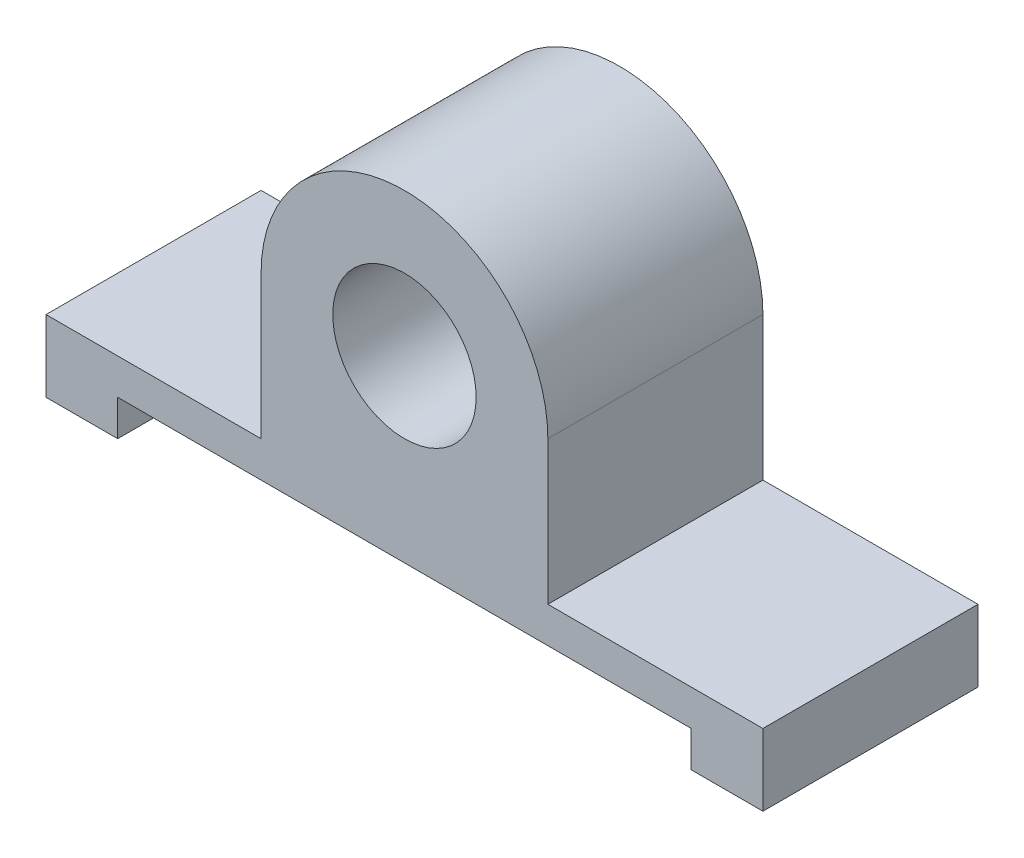
ISO-10303-21;
HEADER;
FILE_DESCRIPTION(('STEP AP214'),'2;1');
FILE_NAME('part.step','',(''),(''),'','','');
FILE_SCHEMA(('AUTOMOTIVE_DESIGN { 1 0 10303 214 1 1 1 1 }'));
ENDSEC;
DATA;
#1=APPLICATION_CONTEXT('core data for automotive mechanical design processes');
#2=APPLICATION_PROTOCOL_DEFINITION('international standard','automotive_design',2000,#1);
#3=PRODUCT_CONTEXT('',#1,'mechanical');
#4=PRODUCT('Part','Part','',(#3));
#5=PRODUCT_RELATED_PRODUCT_CATEGORY('part','',(#4));
#6=PRODUCT_DEFINITION_FORMATION('','',#4);
#7=PRODUCT_DEFINITION_CONTEXT('part definition',#1,'design');
#8=PRODUCT_DEFINITION('design','',#6,#7);
#9=PRODUCT_DEFINITION_SHAPE('','',#8);
#10=(LENGTH_UNIT() NAMED_UNIT(*) SI_UNIT(.MILLI.,.METRE.));
#11=(NAMED_UNIT(*) PLANE_ANGLE_UNIT() SI_UNIT($,.RADIAN.));
#12=(NAMED_UNIT(*) SI_UNIT($,.STERADIAN.) SOLID_ANGLE_UNIT());
#13=UNCERTAINTY_MEASURE_WITH_UNIT(LENGTH_MEASURE(1.E-05),#10,'distance_accuracy_value','');
#14=(GEOMETRIC_REPRESENTATION_CONTEXT(3) GLOBAL_UNCERTAINTY_ASSIGNED_CONTEXT((#13)) GLOBAL_UNIT_ASSIGNED_CONTEXT((#10,
#11,#12)) REPRESENTATION_CONTEXT('',''));
#15=CARTESIAN_POINT('',(0.,0.,0.));
#16=DIRECTION('',(0.,0.,1.));
#17=DIRECTION('',(1.,0.,0.));
#18=AXIS2_PLACEMENT_3D('',#15,#16,#17);
#19=CARTESIAN_POINT('',(0.,25.,30.));
#20=DIRECTION('',(0.,0.,-1.));
#21=DIRECTION('',(-1.,0.,0.));
#22=AXIS2_PLACEMENT_3D('',#19,#20,#21);
#23=PLANE('',#22);
#24=DIRECTION('',(0.,-1.,0.));
#25=VECTOR('',#24,1.);
#26=CARTESIAN_POINT('',(40.,0.,30.));
#27=LINE('',#26,#25);
#28=CARTESIAN_POINT('',(40.,0.,30.));
#29=VERTEX_POINT('',#28);
#30=CARTESIAN_POINT('',(40.,-5.,30.));
#31=VERTEX_POINT('',#30);
#32=EDGE_CURVE('E181',#29,#31,#27,.T.);
#33=ORIENTED_EDGE('',*,*,#32,.T.);
#34=DIRECTION('',(1.,0.,0.));
#35=VECTOR('',#34,1.);
#36=CARTESIAN_POINT('',(40.,-5.,30.));
#37=LINE('',#36,#35);
#38=CARTESIAN_POINT('',(50.,-5.,30.));
#39=VERTEX_POINT('',#38);
#40=EDGE_CURVE('E109',#31,#39,#37,.T.);
#41=ORIENTED_EDGE('',*,*,#40,.T.);
#42=DIRECTION('',(0.,1.,0.));
#43=VECTOR('',#42,1.);
#44=CARTESIAN_POINT('',(50.,-5.,30.));
#45=LINE('',#44,#43);
#46=CARTESIAN_POINT('',(50.,5.,30.));
#47=VERTEX_POINT('',#46);
#48=EDGE_CURVE('E208',#39,#47,#45,.T.);
#49=ORIENTED_EDGE('',*,*,#48,.T.);
#50=DIRECTION('',(-1.,0.,0.));
#51=VECTOR('',#50,1.);
#52=CARTESIAN_POINT('',(50.,5.,30.));
#53=LINE('',#52,#51);
#54=CARTESIAN_POINT('',(20.,4.99999999999999,30.));
#55=VERTEX_POINT('',#54);
#56=EDGE_CURVE('E227',#47,#55,#53,.T.);
#57=ORIENTED_EDGE('',*,*,#56,.T.);
#58=DIRECTION('',(0.,1.,0.));
#59=VECTOR('',#58,1.);
#60=CARTESIAN_POINT('',(20.,4.99999999999999,30.));
#61=LINE('',#60,#59);
#62=CARTESIAN_POINT('',(20.,25.,30.));
#63=VERTEX_POINT('',#62);
#64=EDGE_CURVE('E224',#55,#63,#61,.T.);
#65=ORIENTED_EDGE('',*,*,#64,.T.);
#66=CARTESIAN_POINT('',(0.,25.,30.));
#67=DIRECTION('',(0.,0.,1.));
#68=DIRECTION('',(-1.,0.,0.));
#69=AXIS2_PLACEMENT_3D('',#66,#67,#68);
#70=CIRCLE('',#69,20.);
#71=CARTESIAN_POINT('',(-20.,25.,30.));
#72=VERTEX_POINT('',#71);
#73=EDGE_CURVE('E226',#63,#72,#70,.T.);
#74=ORIENTED_EDGE('',*,*,#73,.T.);
#75=DIRECTION('',(0.,-1.,0.));
#76=VECTOR('',#75,1.);
#77=CARTESIAN_POINT('',(-20.,4.99999999999999,30.));
#78=LINE('',#77,#76);
#79=CARTESIAN_POINT('',(-20.,4.99999999999999,30.));
#80=VERTEX_POINT('',#79);
#81=EDGE_CURVE('E229',#72,#80,#78,.T.);
#82=ORIENTED_EDGE('',*,*,#81,.T.);
#83=DIRECTION('',(-1.,0.,0.));
#84=VECTOR('',#83,1.);
#85=CARTESIAN_POINT('',(-50.,5.,30.));
#86=LINE('',#85,#84);
#87=CARTESIAN_POINT('',(-50.,5.,30.));
#88=VERTEX_POINT('',#87);
#89=EDGE_CURVE('E235',#80,#88,#86,.T.);
#90=ORIENTED_EDGE('',*,*,#89,.T.);
#91=DIRECTION('',(0.,-1.,0.));
#92=VECTOR('',#91,1.);
#93=CARTESIAN_POINT('',(-50.,-5.,30.));
#94=LINE('',#93,#92);
#95=CARTESIAN_POINT('',(-50.,-5.,30.));
#96=VERTEX_POINT('',#95);
#97=EDGE_CURVE('E140',#88,#96,#94,.T.);
#98=ORIENTED_EDGE('',*,*,#97,.T.);
#99=DIRECTION('',(1.,0.,0.));
#100=VECTOR('',#99,1.);
#101=CARTESIAN_POINT('',(-40.,-5.,30.));
#102=LINE('',#101,#100);
#103=CARTESIAN_POINT('',(-40.,-5.,30.));
#104=VERTEX_POINT('',#103);
#105=EDGE_CURVE('E134',#96,#104,#102,.T.);
#106=ORIENTED_EDGE('',*,*,#105,.T.);
#107=DIRECTION('',(0.,1.,0.));
#108=VECTOR('',#107,1.);
#109=CARTESIAN_POINT('',(-40.,0.,30.));
#110=LINE('',#109,#108);
#111=CARTESIAN_POINT('',(-40.,0.,30.));
#112=VERTEX_POINT('',#111);
#113=EDGE_CURVE('E138',#104,#112,#110,.T.);
#114=ORIENTED_EDGE('',*,*,#113,.T.);
#115=DIRECTION('',(1.,0.,0.));
#116=VECTOR('',#115,1.);
#117=CARTESIAN_POINT('',(40.,0.,30.));
#118=LINE('',#117,#116);
#119=EDGE_CURVE('E54',#112,#29,#118,.T.);
#120=ORIENTED_EDGE('',*,*,#119,.T.);
#121=EDGE_LOOP('',(#33,#41,#49,#57,#65,#74,#82,#90,#98,#106,#114,#120));
#122=FACE_BOUND('',#121,.T.);
#123=CARTESIAN_POINT('',(0.,25.,30.));
#124=DIRECTION('',(0.,0.,1.));
#125=DIRECTION('',(1.,0.,0.));
#126=AXIS2_PLACEMENT_3D('',#123,#124,#125);
#127=CIRCLE('',#126,10.);
#128=CARTESIAN_POINT('',(10.,25.,30.));
#129=VERTEX_POINT('',#128);
#130=EDGE_CURVE('E162',#129,#129,#127,.T.);
#131=ORIENTED_EDGE('',*,*,#130,.F.);
#132=EDGE_LOOP('',(#131));
#133=FACE_BOUND('',#132,.T.);
#134=ADVANCED_FACE('F37',(#122,#133),#23,.F.);
#135=CARTESIAN_POINT('',(0.,25.,0.));
#136=DIRECTION('',(0.,0.,-1.));
#137=DIRECTION('',(-1.,0.,0.));
#138=AXIS2_PLACEMENT_3D('',#135,#136,#137);
#139=PLANE('',#138);
#140=DIRECTION('',(0.,-1.,0.));
#141=VECTOR('',#140,1.);
#142=CARTESIAN_POINT('',(40.,0.,0.));
#143=LINE('',#142,#141);
#144=CARTESIAN_POINT('',(40.,0.,0.));
#145=VERTEX_POINT('',#144);
#146=CARTESIAN_POINT('',(40.,-5.,0.));
#147=VERTEX_POINT('',#146);
#148=EDGE_CURVE('E158',#145,#147,#143,.T.);
#149=ORIENTED_EDGE('',*,*,#148,.F.);
#150=DIRECTION('',(1.,0.,0.));
#151=VECTOR('',#150,1.);
#152=CARTESIAN_POINT('',(40.,0.,0.));
#153=LINE('',#152,#151);
#154=CARTESIAN_POINT('',(-40.,0.,0.));
#155=VERTEX_POINT('',#154);
#156=EDGE_CURVE('E101',#155,#145,#153,.T.);
#157=ORIENTED_EDGE('',*,*,#156,.F.);
#158=DIRECTION('',(0.,1.,0.));
#159=VECTOR('',#158,1.);
#160=CARTESIAN_POINT('',(-40.,0.,0.));
#161=LINE('',#160,#159);
#162=CARTESIAN_POINT('',(-40.,-5.,0.));
#163=VERTEX_POINT('',#162);
#164=EDGE_CURVE('E95',#163,#155,#161,.T.);
#165=ORIENTED_EDGE('',*,*,#164,.F.);
#166=DIRECTION('',(1.,0.,0.));
#167=VECTOR('',#166,1.);
#168=CARTESIAN_POINT('',(-40.,-5.,0.));
#169=LINE('',#168,#167);
#170=CARTESIAN_POINT('',(-50.,-5.,0.));
#171=VERTEX_POINT('',#170);
#172=EDGE_CURVE('E148',#171,#163,#169,.T.);
#173=ORIENTED_EDGE('',*,*,#172,.F.);
#174=DIRECTION('',(0.,-1.,0.));
#175=VECTOR('',#174,1.);
#176=CARTESIAN_POINT('',(-50.,-5.,0.));
#177=LINE('',#176,#175);
#178=CARTESIAN_POINT('',(-50.,5.,0.));
#179=VERTEX_POINT('',#178);
#180=EDGE_CURVE('E176',#179,#171,#177,.T.);
#181=ORIENTED_EDGE('',*,*,#180,.F.);
#182=DIRECTION('',(-1.,0.,0.));
#183=VECTOR('',#182,1.);
#184=CARTESIAN_POINT('',(-50.,5.,0.));
#185=LINE('',#184,#183);
#186=CARTESIAN_POINT('',(-20.,4.99999999999999,0.));
#187=VERTEX_POINT('',#186);
#188=EDGE_CURVE('E174',#187,#179,#185,.T.);
#189=ORIENTED_EDGE('',*,*,#188,.F.);
#190=DIRECTION('',(0.,-1.,0.));
#191=VECTOR('',#190,1.);
#192=CARTESIAN_POINT('',(-20.,4.99999999999999,0.));
#193=LINE('',#192,#191);
#194=CARTESIAN_POINT('',(-20.,25.,0.));
#195=VERTEX_POINT('',#194);
#196=EDGE_CURVE('E172',#195,#187,#193,.T.);
#197=ORIENTED_EDGE('',*,*,#196,.F.);
#198=CARTESIAN_POINT('',(0.,25.,0.));
#199=DIRECTION('',(0.,0.,1.));
#200=DIRECTION('',(-1.,0.,0.));
#201=AXIS2_PLACEMENT_3D('',#198,#199,#200);
#202=CIRCLE('',#201,20.);
#203=CARTESIAN_POINT('',(20.,25.,0.));
#204=VERTEX_POINT('',#203);
#205=EDGE_CURVE('E170',#204,#195,#202,.T.);
#206=ORIENTED_EDGE('',*,*,#205,.F.);
#207=DIRECTION('',(0.,1.,0.));
#208=VECTOR('',#207,1.);
#209=CARTESIAN_POINT('',(20.,4.99999999999999,0.));
#210=LINE('',#209,#208);
#211=CARTESIAN_POINT('',(20.,4.99999999999999,0.));
#212=VERTEX_POINT('',#211);
#213=EDGE_CURVE('E168',#212,#204,#210,.T.);
#214=ORIENTED_EDGE('',*,*,#213,.F.);
#215=DIRECTION('',(-1.,0.,0.));
#216=VECTOR('',#215,1.);
#217=CARTESIAN_POINT('',(50.,5.,0.));
#218=LINE('',#217,#216);
#219=CARTESIAN_POINT('',(50.,5.,0.));
#220=VERTEX_POINT('',#219);
#221=EDGE_CURVE('E166',#220,#212,#218,.T.);
#222=ORIENTED_EDGE('',*,*,#221,.F.);
#223=DIRECTION('',(0.,1.,0.));
#224=VECTOR('',#223,1.);
#225=CARTESIAN_POINT('',(50.,-5.,0.));
#226=LINE('',#225,#224);
#227=CARTESIAN_POINT('',(50.,-5.,0.));
#228=VERTEX_POINT('',#227);
#229=EDGE_CURVE('E164',#228,#220,#226,.T.);
#230=ORIENTED_EDGE('',*,*,#229,.F.);
#231=DIRECTION('',(1.,0.,0.));
#232=VECTOR('',#231,1.);
#233=CARTESIAN_POINT('',(40.,-5.,0.));
#234=LINE('',#233,#232);
#235=EDGE_CURVE('E161',#147,#228,#234,.T.);
#236=ORIENTED_EDGE('',*,*,#235,.F.);
#237=EDGE_LOOP('',(#149,#157,#165,#173,#181,#189,#197,#206,#214,#222,#230,#236));
#238=FACE_BOUND('',#237,.T.);
#239=CARTESIAN_POINT('',(0.,25.,0.));
#240=DIRECTION('',(0.,0.,1.));
#241=DIRECTION('',(1.,0.,0.));
#242=AXIS2_PLACEMENT_3D('',#239,#240,#241);
#243=CIRCLE('',#242,10.);
#244=CARTESIAN_POINT('',(10.,25.,0.));
#245=VERTEX_POINT('',#244);
#246=EDGE_CURVE('E412',#245,#245,#243,.T.);
#247=ORIENTED_EDGE('',*,*,#246,.T.);
#248=EDGE_LOOP('',(#247));
#249=FACE_BOUND('',#248,.T.);
#250=ADVANCED_FACE('F212',(#238,#249),#139,.T.);
#251=CARTESIAN_POINT('',(40.,0.,30.));
#252=DIRECTION('',(1.,0.,0.));
#253=DIRECTION('',(0.,0.,-1.));
#254=AXIS2_PLACEMENT_3D('',#251,#252,#253);
#255=PLANE('',#254);
#256=ORIENTED_EDGE('',*,*,#148,.T.);
#257=DIRECTION('',(0.,0.,-1.));
#258=VECTOR('',#257,1.);
#259=CARTESIAN_POINT('',(40.,-5.,30.));
#260=LINE('',#259,#258);
#261=EDGE_CURVE('E11',#31,#147,#260,.T.);
#262=ORIENTED_EDGE('',*,*,#261,.F.);
#263=ORIENTED_EDGE('',*,*,#32,.F.);
#264=DIRECTION('',(0.,0.,-1.));
#265=VECTOR('',#264,1.);
#266=CARTESIAN_POINT('',(40.,0.,30.));
#267=LINE('',#266,#265);
#268=EDGE_CURVE('E154',#29,#145,#267,.T.);
#269=ORIENTED_EDGE('',*,*,#268,.T.);
#270=EDGE_LOOP('',(#256,#262,#263,#269));
#271=FACE_BOUND('',#270,.T.);
#272=ADVANCED_FACE('F39',(#271),#255,.F.);
#273=CARTESIAN_POINT('',(40.,-5.,30.));
#274=DIRECTION('',(0.,1.,0.));
#275=DIRECTION('',(0.,0.,1.));
#276=AXIS2_PLACEMENT_3D('',#273,#274,#275);
#277=PLANE('',#276);
#278=ORIENTED_EDGE('',*,*,#235,.T.);
#279=DIRECTION('',(0.,0.,-1.));
#280=VECTOR('',#279,1.);
#281=CARTESIAN_POINT('',(50.,-5.,30.));
#282=LINE('',#281,#280);
#283=EDGE_CURVE('E46',#39,#228,#282,.T.);
#284=ORIENTED_EDGE('',*,*,#283,.F.);
#285=ORIENTED_EDGE('',*,*,#40,.F.);
#286=ORIENTED_EDGE('',*,*,#261,.T.);
#287=EDGE_LOOP('',(#278,#284,#285,#286));
#288=FACE_BOUND('',#287,.T.);
#289=ADVANCED_FACE('F269',(#288),#277,.F.);
#290=CARTESIAN_POINT('',(50.,-5.,30.));
#291=DIRECTION('',(-1.,0.,0.));
#292=DIRECTION('',(0.,0.,1.));
#293=AXIS2_PLACEMENT_3D('',#290,#291,#292);
#294=PLANE('',#293);
#295=ORIENTED_EDGE('',*,*,#229,.T.);
#296=DIRECTION('',(0.,0.,-1.));
#297=VECTOR('',#296,1.);
#298=CARTESIAN_POINT('',(50.,5.,30.));
#299=LINE('',#298,#297);
#300=EDGE_CURVE('E200',#47,#220,#299,.T.);
#301=ORIENTED_EDGE('',*,*,#300,.F.);
#302=ORIENTED_EDGE('',*,*,#48,.F.);
#303=ORIENTED_EDGE('',*,*,#283,.T.);
#304=EDGE_LOOP('',(#295,#301,#302,#303));
#305=FACE_BOUND('',#304,.T.);
#306=ADVANCED_FACE('F206',(#305),#294,.F.);
#307=CARTESIAN_POINT('',(50.,5.,30.));
#308=DIRECTION('',(0.,-1.,0.));
#309=DIRECTION('',(1.,0.,0.));
#310=AXIS2_PLACEMENT_3D('',#307,#308,#309);
#311=PLANE('',#310);
#312=ORIENTED_EDGE('',*,*,#221,.T.);
#313=DIRECTION('',(0.,0.,-1.));
#314=VECTOR('',#313,1.);
#315=CARTESIAN_POINT('',(20.,4.99999999999999,30.));
#316=LINE('',#315,#314);
#317=EDGE_CURVE('E197',#55,#212,#316,.T.);
#318=ORIENTED_EDGE('',*,*,#317,.F.);
#319=ORIENTED_EDGE('',*,*,#56,.F.);
#320=ORIENTED_EDGE('',*,*,#300,.T.);
#321=EDGE_LOOP('',(#312,#318,#319,#320));
#322=FACE_BOUND('',#321,.T.);
#323=ADVANCED_FACE('F218',(#322),#311,.F.);
#324=CARTESIAN_POINT('',(20.,4.99999999999999,30.));
#325=DIRECTION('',(-1.,0.,0.));
#326=DIRECTION('',(0.,0.,1.));
#327=AXIS2_PLACEMENT_3D('',#324,#325,#326);
#328=PLANE('',#327);
#329=ORIENTED_EDGE('',*,*,#213,.T.);
#330=DIRECTION('',(0.,0.,-1.));
#331=VECTOR('',#330,1.);
#332=CARTESIAN_POINT('',(20.,25.,30.));
#333=LINE('',#332,#331);
#334=EDGE_CURVE('E194',#63,#204,#333,.T.);
#335=ORIENTED_EDGE('',*,*,#334,.F.);
#336=ORIENTED_EDGE('',*,*,#64,.F.);
#337=ORIENTED_EDGE('',*,*,#317,.T.);
#338=EDGE_LOOP('',(#329,#335,#336,#337));
#339=FACE_BOUND('',#338,.T.);
#340=ADVANCED_FACE('F222',(#339),#328,.F.);
#341=CARTESIAN_POINT('',(0.,25.,30.));
#342=DIRECTION('',(0.,0.,-1.));
#343=DIRECTION('',(-1.,0.,0.));
#344=AXIS2_PLACEMENT_3D('',#341,#342,#343);
#345=CYLINDRICAL_SURFACE('',#344,20.);
#346=ORIENTED_EDGE('',*,*,#205,.T.);
#347=DIRECTION('',(0.,0.,-1.));
#348=VECTOR('',#347,1.);
#349=CARTESIAN_POINT('',(-20.,25.,30.));
#350=LINE('',#349,#348);
#351=EDGE_CURVE('E191',#72,#195,#350,.T.);
#352=ORIENTED_EDGE('',*,*,#351,.F.);
#353=ORIENTED_EDGE('',*,*,#73,.F.);
#354=ORIENTED_EDGE('',*,*,#334,.T.);
#355=EDGE_LOOP('',(#346,#352,#353,#354));
#356=FACE_BOUND('',#355,.T.);
#357=ADVANCED_FACE('F282',(#356),#345,.T.);
#358=CARTESIAN_POINT('',(-20.,4.99999999999999,30.));
#359=DIRECTION('',(1.,0.,0.));
#360=DIRECTION('',(0.,0.,-1.));
#361=AXIS2_PLACEMENT_3D('',#358,#359,#360);
#362=PLANE('',#361);
#363=ORIENTED_EDGE('',*,*,#196,.T.);
#364=DIRECTION('',(0.,0.,-1.));
#365=VECTOR('',#364,1.);
#366=CARTESIAN_POINT('',(-20.,4.99999999999999,30.));
#367=LINE('',#366,#365);
#368=EDGE_CURVE('E188',#80,#187,#367,.T.);
#369=ORIENTED_EDGE('',*,*,#368,.F.);
#370=ORIENTED_EDGE('',*,*,#81,.F.);
#371=ORIENTED_EDGE('',*,*,#351,.T.);
#372=EDGE_LOOP('',(#363,#369,#370,#371));
#373=FACE_BOUND('',#372,.T.);
#374=ADVANCED_FACE('F285',(#373),#362,.F.);
#375=CARTESIAN_POINT('',(-50.,5.,30.));
#376=DIRECTION('',(0.,-1.,0.));
#377=DIRECTION('',(1.,0.,0.));
#378=AXIS2_PLACEMENT_3D('',#375,#376,#377);
#379=PLANE('',#378);
#380=ORIENTED_EDGE('',*,*,#188,.T.);
#381=DIRECTION('',(0.,0.,-1.));
#382=VECTOR('',#381,1.);
#383=CARTESIAN_POINT('',(-50.,5.,30.));
#384=LINE('',#383,#382);
#385=EDGE_CURVE('E185',#88,#179,#384,.T.);
#386=ORIENTED_EDGE('',*,*,#385,.F.);
#387=ORIENTED_EDGE('',*,*,#89,.F.);
#388=ORIENTED_EDGE('',*,*,#368,.T.);
#389=EDGE_LOOP('',(#380,#386,#387,#388));
#390=FACE_BOUND('',#389,.T.);
#391=ADVANCED_FACE('F241',(#390),#379,.F.);
#392=CARTESIAN_POINT('',(-50.,-5.,30.));
#393=DIRECTION('',(1.,0.,0.));
#394=DIRECTION('',(0.,0.,-1.));
#395=AXIS2_PLACEMENT_3D('',#392,#393,#394);
#396=PLANE('',#395);
#397=ORIENTED_EDGE('',*,*,#180,.T.);
#398=DIRECTION('',(0.,0.,-1.));
#399=VECTOR('',#398,1.);
#400=CARTESIAN_POINT('',(-50.,-5.,30.));
#401=LINE('',#400,#399);
#402=EDGE_CURVE('E149',#96,#171,#401,.T.);
#403=ORIENTED_EDGE('',*,*,#402,.F.);
#404=ORIENTED_EDGE('',*,*,#97,.F.);
#405=ORIENTED_EDGE('',*,*,#385,.T.);
#406=EDGE_LOOP('',(#397,#403,#404,#405));
#407=FACE_BOUND('',#406,.T.);
#408=ADVANCED_FACE('F245',(#407),#396,.F.);
#409=CARTESIAN_POINT('',(-40.,-5.,30.));
#410=DIRECTION('',(0.,1.,0.));
#411=DIRECTION('',(0.,0.,1.));
#412=AXIS2_PLACEMENT_3D('',#409,#410,#411);
#413=PLANE('',#412);
#414=ORIENTED_EDGE('',*,*,#172,.T.);
#415=DIRECTION('',(0.,0.,-1.));
#416=VECTOR('',#415,1.);
#417=CARTESIAN_POINT('',(-40.,-5.,30.));
#418=LINE('',#417,#416);
#419=EDGE_CURVE('E145',#104,#163,#418,.T.);
#420=ORIENTED_EDGE('',*,*,#419,.F.);
#421=ORIENTED_EDGE('',*,*,#105,.F.);
#422=ORIENTED_EDGE('',*,*,#402,.T.);
#423=EDGE_LOOP('',(#414,#420,#421,#422));
#424=FACE_BOUND('',#423,.T.);
#425=ADVANCED_FACE('F146',(#424),#413,.F.);
#426=CARTESIAN_POINT('',(-40.,0.,30.));
#427=DIRECTION('',(-1.,0.,0.));
#428=DIRECTION('',(0.,0.,1.));
#429=AXIS2_PLACEMENT_3D('',#426,#427,#428);
#430=PLANE('',#429);
#431=ORIENTED_EDGE('',*,*,#164,.T.);
#432=DIRECTION('',(0.,0.,-1.));
#433=VECTOR('',#432,1.);
#434=CARTESIAN_POINT('',(-40.,0.,30.));
#435=LINE('',#434,#433);
#436=EDGE_CURVE('E150',#112,#155,#435,.T.);
#437=ORIENTED_EDGE('',*,*,#436,.F.);
#438=ORIENTED_EDGE('',*,*,#113,.F.);
#439=ORIENTED_EDGE('',*,*,#419,.T.);
#440=EDGE_LOOP('',(#431,#437,#438,#439));
#441=FACE_BOUND('',#440,.T.);
#442=ADVANCED_FACE('F152',(#441),#430,.F.);
#443=CARTESIAN_POINT('',(40.,0.,30.));
#444=DIRECTION('',(0.,1.,0.));
#445=DIRECTION('',(-1.,0.,0.));
#446=AXIS2_PLACEMENT_3D('',#443,#444,#445);
#447=PLANE('',#446);
#448=ORIENTED_EDGE('',*,*,#156,.T.);
#449=ORIENTED_EDGE('',*,*,#268,.F.);
#450=ORIENTED_EDGE('',*,*,#119,.F.);
#451=ORIENTED_EDGE('',*,*,#436,.T.);
#452=EDGE_LOOP('',(#448,#449,#450,#451));
#453=FACE_BOUND('',#452,.T.);
#454=ADVANCED_FACE('F249',(#453),#447,.F.);
#455=CARTESIAN_POINT('',(0.,25.,30.));
#456=DIRECTION('',(0.,0.,-1.));
#457=DIRECTION('',(-1.,0.,0.));
#458=AXIS2_PLACEMENT_3D('',#455,#456,#457);
#459=CYLINDRICAL_SURFACE('',#458,10.);
#460=ORIENTED_EDGE('',*,*,#130,.T.);
#461=EDGE_LOOP('',(#460));
#462=FACE_BOUND('',#461,.T.);
#463=ORIENTED_EDGE('',*,*,#246,.F.);
#464=EDGE_LOOP('',(#463));
#465=FACE_BOUND('',#464,.T.);
#466=ADVANCED_FACE('F251',(#462,#465),#459,.F.);
#467=CLOSED_SHELL('',(#134,#250,#272,#289,#306,#323,#340,#357,#374,#391,#408,#425,#442,#454,#466));
#468=MANIFOLD_SOLID_BREP('B2',#467);
#469=ADVANCED_BREP_SHAPE_REPRESENTATION('',(#18,#468),#14);
#470=SHAPE_DEFINITION_REPRESENTATION(#9,#469);
ENDSEC;
END-ISO-10303-21;
